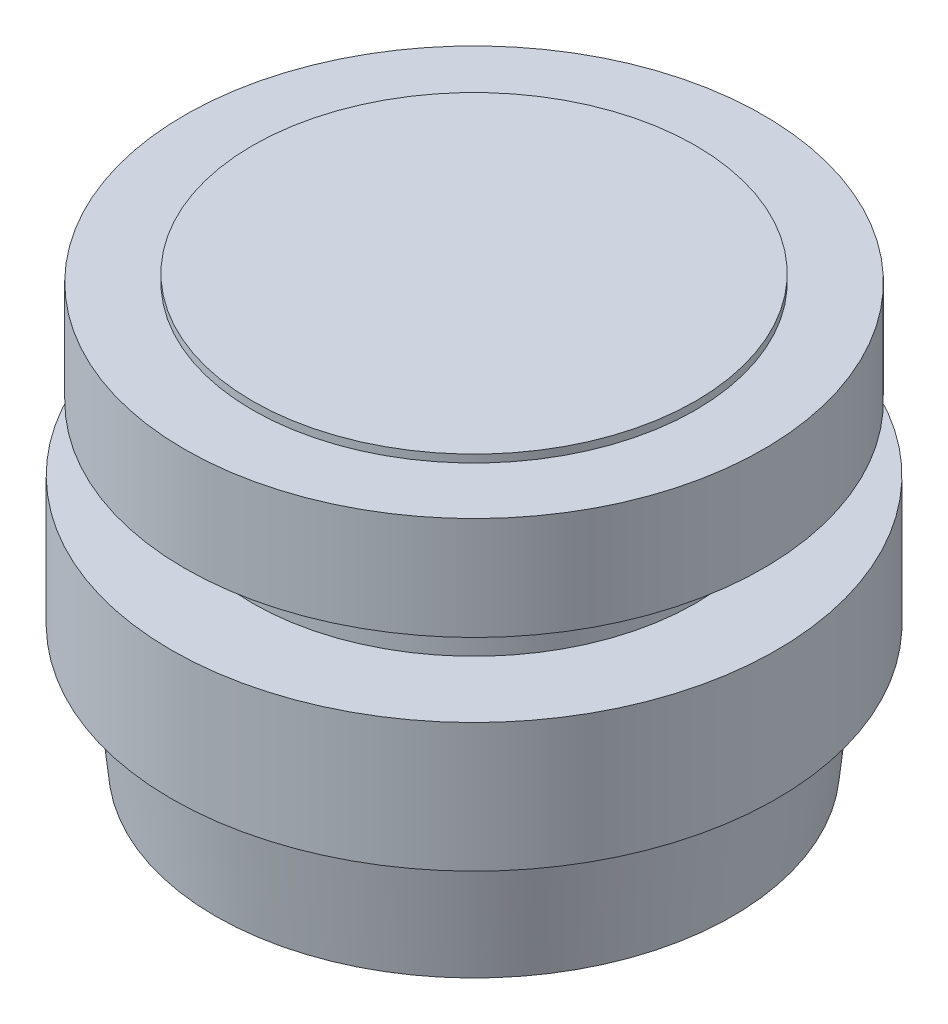
ISO-10303-21;
HEADER;
FILE_DESCRIPTION(('STEP AP214'),'2;1');
FILE_NAME('part.step','',(''),(''),'','','');
FILE_SCHEMA(('AUTOMOTIVE_DESIGN { 1 0 10303 214 1 1 1 1 }'));
ENDSEC;
DATA;
#1=APPLICATION_CONTEXT('core data for automotive mechanical design processes');
#2=APPLICATION_PROTOCOL_DEFINITION('international standard','automotive_design',2000,#1);
#3=PRODUCT_CONTEXT('',#1,'mechanical');
#4=PRODUCT('Part','Part','',(#3));
#5=PRODUCT_RELATED_PRODUCT_CATEGORY('part','',(#4));
#6=PRODUCT_DEFINITION_FORMATION('','',#4);
#7=PRODUCT_DEFINITION_CONTEXT('part definition',#1,'design');
#8=PRODUCT_DEFINITION('design','',#6,#7);
#9=PRODUCT_DEFINITION_SHAPE('','',#8);
#10=(LENGTH_UNIT() NAMED_UNIT(*) SI_UNIT(.MILLI.,.METRE.));
#11=(NAMED_UNIT(*) PLANE_ANGLE_UNIT() SI_UNIT($,.RADIAN.));
#12=(NAMED_UNIT(*) SI_UNIT($,.STERADIAN.) SOLID_ANGLE_UNIT());
#13=UNCERTAINTY_MEASURE_WITH_UNIT(LENGTH_MEASURE(1.E-05),#10,'distance_accuracy_value','');
#14=(GEOMETRIC_REPRESENTATION_CONTEXT(3) GLOBAL_UNCERTAINTY_ASSIGNED_CONTEXT((#13)) GLOBAL_UNIT_ASSIGNED_CONTEXT((#10,
#11,#12)) REPRESENTATION_CONTEXT('',''));
#15=CARTESIAN_POINT('',(0.,0.,0.));
#16=DIRECTION('',(0.,0.,1.));
#17=DIRECTION('',(1.,0.,0.));
#18=AXIS2_PLACEMENT_3D('',#15,#16,#17);
#19=CARTESIAN_POINT('',(0.,14.986,0.));
#20=DIRECTION('',(0.,-1.,0.));
#21=DIRECTION('',(0.,0.,-1.));
#22=AXIS2_PLACEMENT_3D('',#19,#20,#21);
#23=CYLINDRICAL_SURFACE('',#22,10.922);
#24=CARTESIAN_POINT('',(0.,6.35,0.));
#25=DIRECTION('',(0.,1.,0.));
#26=DIRECTION('',(0.,0.,1.));
#27=AXIS2_PLACEMENT_3D('',#24,#25,#26);
#28=CIRCLE('',#27,10.922);
#29=CARTESIAN_POINT('',(0.,6.35,10.922));
#30=VERTEX_POINT('',#29);
#31=EDGE_CURVE('E54',#30,#30,#28,.T.);
#32=ORIENTED_EDGE('',*,*,#31,.T.);
#33=EDGE_LOOP('',(#32));
#34=FACE_BOUND('',#33,.T.);
#35=CARTESIAN_POINT('',(0.,9.525,0.));
#36=DIRECTION('',(0.,1.,0.));
#37=DIRECTION('',(0.,0.,1.));
#38=AXIS2_PLACEMENT_3D('',#35,#36,#37);
#39=CIRCLE('',#38,10.922);
#40=CARTESIAN_POINT('',(0.,9.525,10.922));
#41=VERTEX_POINT('',#40);
#42=EDGE_CURVE('E11',#41,#41,#39,.T.);
#43=ORIENTED_EDGE('',*,*,#42,.F.);
#44=EDGE_LOOP('',(#43));
#45=FACE_BOUND('',#44,.T.);
#46=ADVANCED_FACE('F34',(#34,#45),#23,.T.);
#47=CARTESIAN_POINT('',(0.,6.35,0.));
#48=DIRECTION('',(0.,1.,0.));
#49=DIRECTION('',(0.,0.,1.));
#50=AXIS2_PLACEMENT_3D('',#47,#48,#49);
#51=PLANE('',#50);
#52=CARTESIAN_POINT('',(0.,6.35,0.));
#53=DIRECTION('',(0.,1.,0.));
#54=DIRECTION('',(0.,0.,1.));
#55=AXIS2_PLACEMENT_3D('',#52,#53,#54);
#56=CIRCLE('',#55,14.9225);
#57=CARTESIAN_POINT('',(0.,6.35,14.9225));
#58=VERTEX_POINT('',#57);
#59=EDGE_CURVE('E47',#58,#58,#56,.T.);
#60=ORIENTED_EDGE('',*,*,#59,.T.);
#61=EDGE_LOOP('',(#60));
#62=FACE_BOUND('',#61,.T.);
#63=ORIENTED_EDGE('',*,*,#31,.F.);
#64=EDGE_LOOP('',(#63));
#65=FACE_BOUND('',#64,.T.);
#66=ADVANCED_FACE('F86',(#62,#65),#51,.T.);
#67=CARTESIAN_POINT('',(0.,0.,0.));
#68=DIRECTION('',(0.,1.,0.));
#69=DIRECTION('',(0.,0.,1.));
#70=AXIS2_PLACEMENT_3D('',#67,#68,#69);
#71=PLANE('',#70);
#72=CARTESIAN_POINT('',(0.,0.,0.));
#73=DIRECTION('',(0.,1.,0.));
#74=DIRECTION('',(0.,0.,1.));
#75=AXIS2_PLACEMENT_3D('',#72,#73,#74);
#76=CIRCLE('',#75,14.9225);
#77=CARTESIAN_POINT('',(0.,0.,14.9225));
#78=VERTEX_POINT('',#77);
#79=EDGE_CURVE('E50',#78,#78,#76,.T.);
#80=ORIENTED_EDGE('',*,*,#79,.F.);
#81=EDGE_LOOP('',(#80));
#82=FACE_BOUND('',#81,.T.);
#83=CARTESIAN_POINT('',(0.,0.,0.));
#84=DIRECTION('',(0.,1.,0.));
#85=DIRECTION('',(0.,0.,1.));
#86=AXIS2_PLACEMENT_3D('',#83,#84,#85);
#87=CIRCLE('',#86,13.395629591765);
#88=CARTESIAN_POINT('',(0.,0.,13.395629591765));
#89=VERTEX_POINT('',#88);
#90=EDGE_CURVE('E42',#89,#89,#87,.F.);
#91=ORIENTED_EDGE('',*,*,#90,.F.);
#92=EDGE_LOOP('',(#91));
#93=FACE_BOUND('',#92,.T.);
#94=ADVANCED_FACE('F83',(#82,#93),#71,.F.);
#95=CARTESIAN_POINT('',(0.,6.35,0.));
#96=DIRECTION('',(0.,-1.,0.));
#97=DIRECTION('',(0.,0.,-1.));
#98=AXIS2_PLACEMENT_3D('',#95,#96,#97);
#99=CYLINDRICAL_SURFACE('',#98,14.9225);
#100=ORIENTED_EDGE('',*,*,#59,.F.);
#101=EDGE_LOOP('',(#100));
#102=FACE_BOUND('',#101,.T.);
#103=ORIENTED_EDGE('',*,*,#79,.T.);
#104=EDGE_LOOP('',(#103));
#105=FACE_BOUND('',#104,.T.);
#106=ADVANCED_FACE('F36',(#102,#105),#99,.T.);
#107=CARTESIAN_POINT('',(0.,14.605,0.));
#108=DIRECTION('',(0.,1.,0.));
#109=DIRECTION('',(0.,0.,1.));
#110=AXIS2_PLACEMENT_3D('',#107,#108,#109);
#111=PLANE('',#110);
#112=CARTESIAN_POINT('',(0.,14.605,0.));
#113=DIRECTION('',(0.,1.,0.));
#114=DIRECTION('',(0.,0.,1.));
#115=AXIS2_PLACEMENT_3D('',#112,#113,#114);
#116=CIRCLE('',#115,14.2762763296202);
#117=CARTESIAN_POINT('',(0.,14.605,14.2762763296202));
#118=VERTEX_POINT('',#117);
#119=EDGE_CURVE('E55',#118,#118,#116,.T.);
#120=ORIENTED_EDGE('',*,*,#119,.T.);
#121=EDGE_LOOP('',(#120));
#122=FACE_BOUND('',#121,.T.);
#123=CARTESIAN_POINT('',(0.,14.605,0.));
#124=DIRECTION('',(0.,1.,0.));
#125=DIRECTION('',(0.,0.,1.));
#126=AXIS2_PLACEMENT_3D('',#123,#124,#125);
#127=CIRCLE('',#126,10.922);
#128=CARTESIAN_POINT('',(0.,14.605,10.922));
#129=VERTEX_POINT('',#128);
#130=EDGE_CURVE('E52',#129,#129,#127,.T.);
#131=ORIENTED_EDGE('',*,*,#130,.F.);
#132=EDGE_LOOP('',(#131));
#133=FACE_BOUND('',#132,.T.);
#134=ADVANCED_FACE('F134',(#122,#133),#111,.T.);
#135=CARTESIAN_POINT('',(0.,9.525,0.));
#136=DIRECTION('',(0.,1.,0.));
#137=DIRECTION('',(0.,0.,1.));
#138=AXIS2_PLACEMENT_3D('',#135,#136,#137);
#139=PLANE('',#138);
#140=CARTESIAN_POINT('',(0.,9.525,0.));
#141=DIRECTION('',(0.,1.,0.));
#142=DIRECTION('',(0.,0.,1.));
#143=AXIS2_PLACEMENT_3D('',#140,#141,#142);
#144=CIRCLE('',#143,14.2762763296202);
#145=CARTESIAN_POINT('',(0.,9.525,14.2762763296202));
#146=VERTEX_POINT('',#145);
#147=EDGE_CURVE('E62',#146,#146,#144,.T.);
#148=ORIENTED_EDGE('',*,*,#147,.F.);
#149=EDGE_LOOP('',(#148));
#150=FACE_BOUND('',#149,.T.);
#151=ORIENTED_EDGE('',*,*,#42,.T.);
#152=EDGE_LOOP('',(#151));
#153=FACE_BOUND('',#152,.T.);
#154=ADVANCED_FACE('F128',(#150,#153),#139,.F.);
#155=CARTESIAN_POINT('',(0.,14.605,0.));
#156=DIRECTION('',(0.,-1.,0.));
#157=DIRECTION('',(0.,0.,-1.));
#158=AXIS2_PLACEMENT_3D('',#155,#156,#157);
#159=CYLINDRICAL_SURFACE('',#158,14.2762763296202);
#160=ORIENTED_EDGE('',*,*,#119,.F.);
#161=EDGE_LOOP('',(#160));
#162=FACE_BOUND('',#161,.T.);
#163=ORIENTED_EDGE('',*,*,#147,.T.);
#164=EDGE_LOOP('',(#163));
#165=FACE_BOUND('',#164,.T.);
#166=ADVANCED_FACE('F121',(#162,#165),#159,.T.);
#167=CARTESIAN_POINT('',(0.,14.986,0.));
#168=DIRECTION('',(0.,1.,0.));
#169=DIRECTION('',(0.,0.,1.));
#170=AXIS2_PLACEMENT_3D('',#167,#168,#169);
#171=PLANE('',#170);
#172=CARTESIAN_POINT('',(0.,14.986,0.));
#173=DIRECTION('',(0.,1.,0.));
#174=DIRECTION('',(0.,0.,1.));
#175=AXIS2_PLACEMENT_3D('',#172,#173,#174);
#176=CIRCLE('',#175,10.922);
#177=CARTESIAN_POINT('',(0.,14.986,10.922));
#178=VERTEX_POINT('',#177);
#179=EDGE_CURVE('E59',#178,#178,#176,.T.);
#180=ORIENTED_EDGE('',*,*,#179,.T.);
#181=EDGE_LOOP('',(#180));
#182=FACE_BOUND('',#181,.T.);
#183=ADVANCED_FACE('F117',(#182),#171,.T.);
#184=ORIENTED_EDGE('',*,*,#130,.T.);
#185=EDGE_LOOP('',(#184));
#186=FACE_BOUND('',#185,.T.);
#187=ORIENTED_EDGE('',*,*,#179,.F.);
#188=EDGE_LOOP('',(#187));
#189=FACE_BOUND('',#188,.T.);
#190=ADVANCED_FACE('F102',(#186,#189),#23,.T.);
#191=CARTESIAN_POINT('',(0.,0.,0.));
#192=DIRECTION('',(0.,-1.,0.));
#193=DIRECTION('',(0.,0.,-1.));
#194=AXIS2_PLACEMENT_3D('',#191,#192,#193);
#195=CONICAL_SURFACE('',#194,11.049,0.10471975511966);
#196=CARTESIAN_POINT('',(0.,-6.096,0.));
#197=DIRECTION('',(0.,1.,0.));
#198=DIRECTION('',(0.,0.,1.));
#199=AXIS2_PLACEMENT_3D('',#196,#197,#198);
#200=CIRCLE('',#199,11.6897154181796);
#201=CARTESIAN_POINT('',(0.,-6.096,11.6897154181796));
#202=VERTEX_POINT('',#201);
#203=EDGE_CURVE('E69',#202,#202,#200,.T.);
#204=ORIENTED_EDGE('',*,*,#203,.F.);
#205=EDGE_LOOP('',(#204));
#206=FACE_BOUND('',#205,.T.);
#207=CARTESIAN_POINT('',(0.,-2.58305853768157,0.));
#208=DIRECTION('',(0.,-1.,0.));
#209=DIRECTION('',(0.,0.,-1.));
#210=AXIS2_PLACEMENT_3D('',#207,#208,#209);
#211=CIRCLE('',#210,11.3204903922495);
#212=CARTESIAN_POINT('',(0.,-2.58305853768157,-11.3204903922495));
#213=VERTEX_POINT('',#212);
#214=EDGE_CURVE('E38',#213,#213,#211,.T.);
#215=ORIENTED_EDGE('',*,*,#214,.F.);
#216=EDGE_LOOP('',(#215));
#217=FACE_BOUND('',#216,.T.);
#218=ADVANCED_FACE('F92',(#206,#217),#195,.F.);
#219=CARTESIAN_POINT('',(0.,0.,0.));
#220=DIRECTION('',(0.,1.,0.));
#221=DIRECTION('',(0.,0.,-1.));
#222=AXIS2_PLACEMENT_3D('',#219,#220,#221);
#223=CONICAL_SURFACE('',#222,13.395629591765,0.10471975511966);
#224=CARTESIAN_POINT('',(0.,-6.096,0.));
#225=DIRECTION('',(0.,1.,0.));
#226=DIRECTION('',(0.,0.,1.));
#227=AXIS2_PLACEMENT_3D('',#224,#225,#226);
#228=CIRCLE('',#227,12.7549141735855);
#229=CARTESIAN_POINT('',(0.,-6.096,12.7549141735855));
#230=VERTEX_POINT('',#229);
#231=EDGE_CURVE('E228',#230,#230,#228,.T.);
#232=ORIENTED_EDGE('',*,*,#231,.T.);
#233=EDGE_LOOP('',(#232));
#234=FACE_BOUND('',#233,.T.);
#235=ORIENTED_EDGE('',*,*,#90,.T.);
#236=EDGE_LOOP('',(#235));
#237=FACE_BOUND('',#236,.T.);
#238=ADVANCED_FACE('F89',(#234,#237),#223,.T.);
#239=CARTESIAN_POINT('',(0.,-6.096,0.));
#240=DIRECTION('',(0.,1.,0.));
#241=DIRECTION('',(0.,0.,1.));
#242=AXIS2_PLACEMENT_3D('',#239,#240,#241);
#243=PLANE('',#242);
#244=ORIENTED_EDGE('',*,*,#203,.T.);
#245=EDGE_LOOP('',(#244));
#246=FACE_BOUND('',#245,.T.);
#247=ORIENTED_EDGE('',*,*,#231,.F.);
#248=EDGE_LOOP('',(#247));
#249=FACE_BOUND('',#248,.T.);
#250=ADVANCED_FACE('F91',(#246,#249),#243,.F.);
#251=CARTESIAN_POINT('',(0.,-2.921,0.));
#252=DIRECTION('',(0.,1.,0.));
#253=DIRECTION('',(0.,0.,1.));
#254=AXIS2_PLACEMENT_3D('',#251,#252,#253);
#255=PLANE('',#254);
#256=CARTESIAN_POINT('',(0.,-2.921,0.));
#257=DIRECTION('',(0.,1.,0.));
#258=DIRECTION('',(0.,0.,1.));
#259=AXIS2_PLACEMENT_3D('',#256,#257,#258);
#260=CIRCLE('',#259,11.049);
#261=CARTESIAN_POINT('',(0.,-2.921,11.049));
#262=VERTEX_POINT('',#261);
#263=EDGE_CURVE('E73',#262,#262,#260,.T.);
#264=ORIENTED_EDGE('',*,*,#263,.F.);
#265=EDGE_LOOP('',(#264));
#266=FACE_BOUND('',#265,.T.);
#267=ADVANCED_FACE('F99',(#266),#255,.F.);
#268=CARTESIAN_POINT('',(0.,-2.921,0.));
#269=DIRECTION('',(0.,1.,0.));
#270=DIRECTION('',(0.,0.,1.));
#271=AXIS2_PLACEMENT_3D('',#268,#269,#270);
#272=CONICAL_SURFACE('',#271,11.049,0.676789494937986);
#273=ORIENTED_EDGE('',*,*,#214,.T.);
#274=EDGE_LOOP('',(#273));
#275=FACE_BOUND('',#274,.T.);
#276=ORIENTED_EDGE('',*,*,#263,.T.);
#277=EDGE_LOOP('',(#276));
#278=FACE_BOUND('',#277,.T.);
#279=ADVANCED_FACE('F204',(#275,#278),#272,.T.);
#280=CLOSED_SHELL('',(#46,#66,#94,#106,#134,#154,#166,#183,#190,#218,#238,#250,#267,#279));
#281=MANIFOLD_SOLID_BREP('B2',#280);
#282=ADVANCED_BREP_SHAPE_REPRESENTATION('',(#18,#281),#14);
#283=SHAPE_DEFINITION_REPRESENTATION(#9,#282);
ENDSEC;
END-ISO-10303-21;
